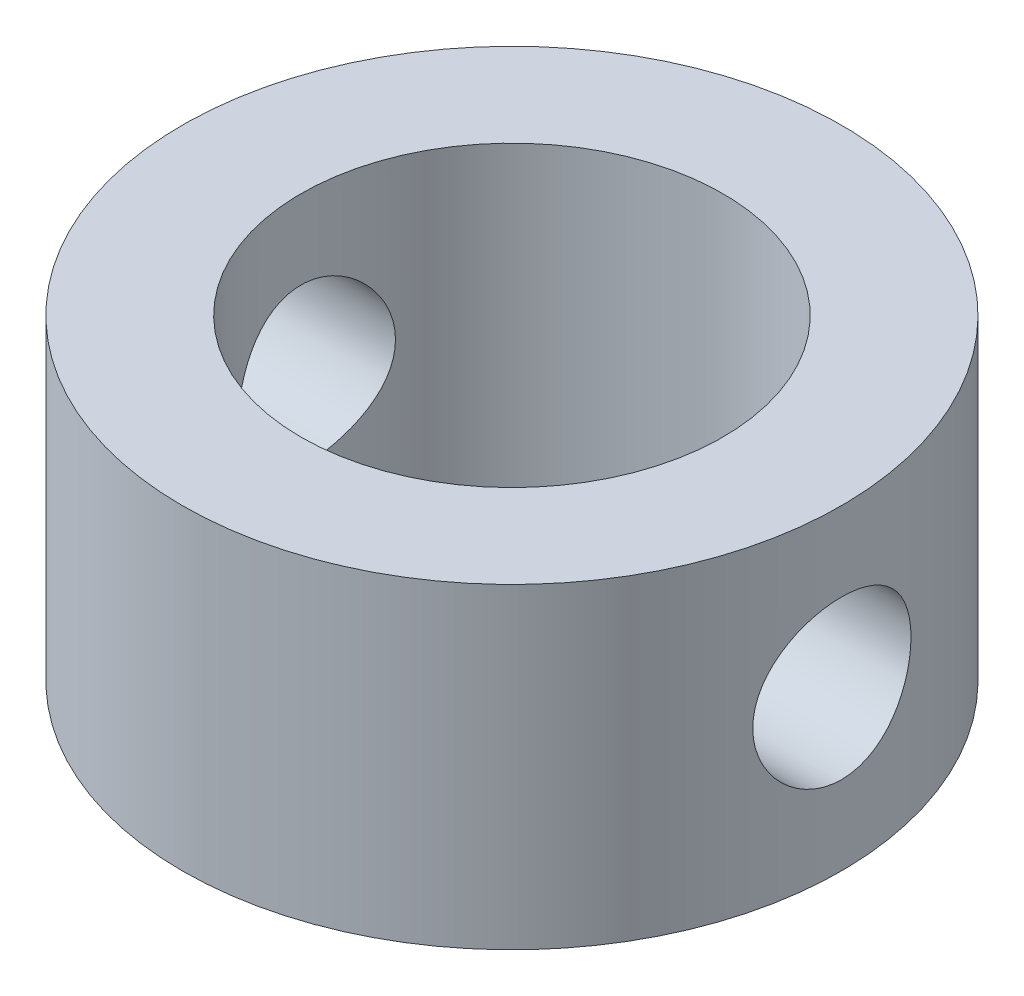
ISO-10303-21;
HEADER;
FILE_DESCRIPTION(('STEP AP214'),'2;1');
FILE_NAME('part.step','',(''),(''),'','','');
FILE_SCHEMA(('AUTOMOTIVE_DESIGN { 1 0 10303 214 1 1 1 1 }'));
ENDSEC;
DATA;
#1=APPLICATION_CONTEXT('core data for automotive mechanical design processes');
#2=APPLICATION_PROTOCOL_DEFINITION('international standard','automotive_design',2000,#1);
#3=PRODUCT_CONTEXT('',#1,'mechanical');
#4=PRODUCT('Part','Part','',(#3));
#5=PRODUCT_RELATED_PRODUCT_CATEGORY('part','',(#4));
#6=PRODUCT_DEFINITION_FORMATION('','',#4);
#7=PRODUCT_DEFINITION_CONTEXT('part definition',#1,'design');
#8=PRODUCT_DEFINITION('design','',#6,#7);
#9=PRODUCT_DEFINITION_SHAPE('','',#8);
#10=(LENGTH_UNIT() NAMED_UNIT(*) SI_UNIT(.MILLI.,.METRE.));
#11=(NAMED_UNIT(*) PLANE_ANGLE_UNIT() SI_UNIT($,.RADIAN.));
#12=(NAMED_UNIT(*) SI_UNIT($,.STERADIAN.) SOLID_ANGLE_UNIT());
#13=UNCERTAINTY_MEASURE_WITH_UNIT(LENGTH_MEASURE(1.E-05),#10,'distance_accuracy_value','');
#14=(GEOMETRIC_REPRESENTATION_CONTEXT(3) GLOBAL_UNCERTAINTY_ASSIGNED_CONTEXT((#13)) GLOBAL_UNIT_ASSIGNED_CONTEXT((#10,
#11,#12)) REPRESENTATION_CONTEXT('',''));
#15=CARTESIAN_POINT('',(0.,0.,0.));
#16=DIRECTION('',(0.,0.,1.));
#17=DIRECTION('',(1.,0.,0.));
#18=AXIS2_PLACEMENT_3D('',#15,#16,#17);
#19=CARTESIAN_POINT('',(0.,12.,0.));
#20=DIRECTION('',(0.,1.,0.));
#21=DIRECTION('',(0.,0.,1.));
#22=AXIS2_PLACEMENT_3D('',#19,#20,#21);
#23=PLANE('',#22);
#24=CARTESIAN_POINT('',(0.,12.,0.));
#25=DIRECTION('',(0.,1.,0.));
#26=DIRECTION('',(0.,0.,1.));
#27=AXIS2_PLACEMENT_3D('',#24,#25,#26);
#28=CIRCLE('',#27,12.5);
#29=CARTESIAN_POINT('',(0.,12.,12.5));
#30=VERTEX_POINT('',#29);
#31=EDGE_CURVE('E10',#30,#30,#28,.T.);
#32=ORIENTED_EDGE('',*,*,#31,.T.);
#33=EDGE_LOOP('',(#32));
#34=FACE_BOUND('',#33,.T.);
#35=CARTESIAN_POINT('',(0.,12.,0.));
#36=DIRECTION('',(0.,1.,0.));
#37=DIRECTION('',(0.,0.,1.));
#38=AXIS2_PLACEMENT_3D('',#35,#36,#37);
#39=CIRCLE('',#38,8.);
#40=CARTESIAN_POINT('',(0.,12.,8.));
#41=VERTEX_POINT('',#40);
#42=EDGE_CURVE('E49',#41,#41,#39,.T.);
#43=ORIENTED_EDGE('',*,*,#42,.F.);
#44=EDGE_LOOP('',(#43));
#45=FACE_BOUND('',#44,.T.);
#46=ADVANCED_FACE('F31',(#34,#45),#23,.T.);
#47=CARTESIAN_POINT('',(0.,0.,0.));
#48=DIRECTION('',(0.,1.,0.));
#49=DIRECTION('',(0.,0.,1.));
#50=AXIS2_PLACEMENT_3D('',#47,#48,#49);
#51=PLANE('',#50);
#52=CARTESIAN_POINT('',(0.,0.,0.));
#53=DIRECTION('',(0.,1.,0.));
#54=DIRECTION('',(0.,0.,1.));
#55=AXIS2_PLACEMENT_3D('',#52,#53,#54);
#56=CIRCLE('',#55,12.5);
#57=CARTESIAN_POINT('',(0.,0.,12.5));
#58=VERTEX_POINT('',#57);
#59=EDGE_CURVE('E44',#58,#58,#56,.T.);
#60=ORIENTED_EDGE('',*,*,#59,.F.);
#61=EDGE_LOOP('',(#60));
#62=FACE_BOUND('',#61,.T.);
#63=CARTESIAN_POINT('',(0.,0.,0.));
#64=DIRECTION('',(0.,1.,0.));
#65=DIRECTION('',(0.,0.,1.));
#66=AXIS2_PLACEMENT_3D('',#63,#64,#65);
#67=CIRCLE('',#66,8.);
#68=CARTESIAN_POINT('',(0.,0.,8.));
#69=VERTEX_POINT('',#68);
#70=EDGE_CURVE('E52',#69,#69,#67,.T.);
#71=ORIENTED_EDGE('',*,*,#70,.T.);
#72=EDGE_LOOP('',(#71));
#73=FACE_BOUND('',#72,.T.);
#74=ADVANCED_FACE('F85',(#62,#73),#51,.F.);
#75=CARTESIAN_POINT('',(0.,12.,0.));
#76=DIRECTION('',(0.,-1.,0.));
#77=DIRECTION('',(0.,0.,-1.));
#78=AXIS2_PLACEMENT_3D('',#75,#76,#77);
#79=CYLINDRICAL_SURFACE('',#78,12.5);
#80=CARTESIAN_POINT('',(-12.1346610995116,6.,-3.));
#81=CARTESIAN_POINT('',(-12.1346643709057,6.16588631394364,-2.99999492639599));
#82=CARTESIAN_POINT('',(-12.1380998279897,6.33183030182243,-2.98619401575549));
#83=CARTESIAN_POINT('',(-12.1514386999622,6.65896835271962,-2.93143372377318));
#84=CARTESIAN_POINT('',(-12.1613461803941,6.82015936348798,-2.89045727127241));
#85=CARTESIAN_POINT('',(-12.1864438536979,7.13301229540291,-2.78273587845348));
#86=CARTESIAN_POINT('',(-12.2016275682829,7.28468563419401,-2.71602252749926));
#87=CARTESIAN_POINT('',(-12.2355589227548,7.57469954365719,-2.55881551789466));
#88=CARTESIAN_POINT('',(-12.2543066403104,7.71303982366955,-2.46832134098417));
#89=CARTESIAN_POINT('',(-12.2936793084446,7.97526881494018,-2.26416092165145));
#90=CARTESIAN_POINT('',(-12.3143323081787,8.09884715598952,-2.15010136587795));
#91=CARTESIAN_POINT('',(-12.3549444196641,8.32531539443417,-1.90289576315871));
#92=CARTESIAN_POINT('',(-12.3749034702238,8.42820347119262,-1.7697480383165));
#93=CARTESIAN_POINT('',(-12.4121875957975,8.61162643270601,-1.48603435008244));
#94=CARTESIAN_POINT('',(-12.429475709008,8.69185852354929,-1.33526735140698));
#95=CARTESIAN_POINT('',(-12.4591511096292,8.82572653731784,-1.0219036434405));
#96=CARTESIAN_POINT('',(-12.471539061815,8.87936606814532,-0.859308542342423));
#97=CARTESIAN_POINT('',(-12.4898200905274,8.95753815438648,-0.530137152798909));
#98=CARTESIAN_POINT('',(-12.4958305032045,8.98259721420822,-0.363692527540998));
#99=CARTESIAN_POINT('',(-12.5010873481438,9.00454751969164,-0.028860573975858));
#100=CARTESIAN_POINT('',(-12.5003347050497,9.00144261592415,0.139526485618309));
#101=CARTESIAN_POINT('',(-12.4922383642801,8.96753629921501,0.469819197188796));
#102=CARTESIAN_POINT('',(-12.4850298487431,8.93730291583144,0.631786969117105));
#103=CARTESIAN_POINT('',(-12.4649879597451,8.85090826203714,0.948279915829272));
#104=CARTESIAN_POINT('',(-12.4521543006312,8.79474567489715,1.10280471220598));
#105=CARTESIAN_POINT('',(-12.4220937673228,8.65761316725222,1.40154850796015));
#106=CARTESIAN_POINT('',(-12.4048305309055,8.57643674423159,1.54566890739797));
#107=CARTESIAN_POINT('',(-12.3677903650575,8.39173656633371,1.8184437481507));
#108=CARTESIAN_POINT('',(-12.3480130295253,8.28820919922672,1.94709568430374));
#109=CARTESIAN_POINT('',(-12.307523454591,8.0586845989154,2.18866676072892));
#110=CARTESIAN_POINT('',(-12.2868002024656,7.93219063383104,2.30111257110784));
#111=CARTESIAN_POINT('',(-12.247210122564,7.66192436384159,2.50329554889259));
#112=CARTESIAN_POINT('',(-12.2283433682075,7.51815137609684,2.59303181841776));
#113=CARTESIAN_POINT('',(-12.1945661246798,7.21653474373689,2.74751986313759));
#114=CARTESIAN_POINT('',(-12.1796724534131,7.05863494892363,2.81216594132899));
#115=CARTESIAN_POINT('',(-12.155748323081,6.73376687652317,2.91385324316721));
#116=CARTESIAN_POINT('',(-12.1467167199581,6.56680037531667,2.95089985341171));
#117=CARTESIAN_POINT('',(-12.1357772660229,6.23290661993213,2.99556850234642));
#118=CARTESIAN_POINT('',(-12.1337008786289,6.06607792748918,3.0038868332891));
#119=CARTESIAN_POINT('',(-12.1364495609797,5.7334168059252,2.99276203410493));
#120=CARTESIAN_POINT('',(-12.1412740503119,5.56758429419628,2.97332123871795));
#121=CARTESIAN_POINT('',(-12.1571201522343,5.24415408273907,2.90783852027801));
#122=CARTESIAN_POINT('',(-12.1680489760353,5.08647082408308,2.86219461484814));
#123=CARTESIAN_POINT('',(-12.1947857126682,4.78099217933293,2.74603914988784));
#124=CARTESIAN_POINT('',(-12.2105941678427,4.6331978945637,2.6755248260303));
#125=CARTESIAN_POINT('',(-12.2456689266469,4.34872124779604,2.51014743676234));
#126=CARTESIAN_POINT('',(-12.2649930224287,4.21229062599396,2.41486385815303));
#127=CARTESIAN_POINT('',(-12.3047764880024,3.95709926610609,2.2031905161038));
#128=CARTESIAN_POINT('',(-12.3252360287629,3.83834119901455,2.08679756812263));
#129=CARTESIAN_POINT('',(-12.3655511140332,3.61908499039076,1.8330286051264));
#130=CARTESIAN_POINT('',(-12.3853821651221,3.51906624401033,1.69523379949056));
#131=CARTESIAN_POINT('',(-12.4217193399952,3.34359153691497,1.40439761806721));
#132=CARTESIAN_POINT('',(-12.438225632785,3.26813432755534,1.25135701785302));
#133=CARTESIAN_POINT('',(-12.4659520953338,3.14455252272497,0.935406182533393));
#134=CARTESIAN_POINT('',(-12.4772089625634,3.09623767947837,0.772573732033521));
#135=CARTESIAN_POINT('',(-12.4933282808784,3.02773217960314,0.440797516621208));
#136=CARTESIAN_POINT('',(-12.4981918632553,3.00753654724451,0.271854838350956));
#137=CARTESIAN_POINT('',(-12.5009346170348,2.99610413221297,-0.0628273325379076));
#138=CARTESIAN_POINT('',(-12.4989850590467,3.0041572440584,-0.22854154859205));
#139=CARTESIAN_POINT('',(-12.4886960978661,3.04737996301755,-0.556181588106272));
#140=CARTESIAN_POINT('',(-12.4803568581455,3.08254887640871,-0.718107508375785));
#141=CARTESIAN_POINT('',(-12.4582475403262,3.17863682511571,-1.03289533638029));
#142=CARTESIAN_POINT('',(-12.4445026408745,3.23943656944082,-1.18579554017999));
#143=CARTESIAN_POINT('',(-12.4130357959962,3.3849502441486,-1.47930912419136));
#144=CARTESIAN_POINT('',(-12.3953133850962,3.46966697374628,-1.61992106367531));
#145=CARTESIAN_POINT('',(-12.3573152907204,3.66282547427691,-1.88826701153781));
#146=CARTESIAN_POINT('',(-12.3369914041701,3.77175507074358,-2.01564306622629));
#147=CARTESIAN_POINT('',(-12.2963112747441,4.00928761058973,-2.25054951565269));
#148=CARTESIAN_POINT('',(-12.2759550250775,4.13789544073631,-2.35807496614236));
#149=CARTESIAN_POINT('',(-12.2371275634283,4.41373939416014,-2.5519948518568));
#150=CARTESIAN_POINT('',(-12.2186938455572,4.561252620507,-2.63800316633773));
#151=CARTESIAN_POINT('',(-12.1862909651906,4.86906184650554,-2.78387070894251));
#152=CARTESIAN_POINT('',(-12.1723183758181,5.02934791567107,-2.84375002144868));
#153=CARTESIAN_POINT('',(-12.1527391085338,5.32459285351408,-2.92614436386637));
#154=CARTESIAN_POINT('',(-12.1460087939348,5.4580708282112,-2.95378236710749));
#155=CARTESIAN_POINT('',(-12.1369686046644,5.7276863740708,-2.99071161192546));
#156=CARTESIAN_POINT('',(-12.1346584140208,5.86382375442303,-3.00000416492674));
#157=CARTESIAN_POINT('',(-12.1346610995116,6.,-3.));
#158=B_SPLINE_CURVE_WITH_KNOTS('',3,(#80,#81,#82,#83,#84,#85,#86,#87,#88,#89,#90,#91,#92,#93,
#94,#95,#96,#97,#98,#99,#100,#101,#102,#103,#104,#105,#106,#107,#108,#109,#110,#111,#112,#113,
#114,#115,#116,#117,#118,#119,#120,#121,#122,#123,#124,#125,#126,#127,#128,#129,#130,#131,#132,
#133,#134,#135,#136,#137,#138,#139,#140,#141,#142,#143,#144,#145,#146,#147,#148,#149,#150,#151,
#152,#153,#154,#155,#156,#157),.UNSPECIFIED.,.T.,.F.,(4,2,2,2,2,2,2,2,2,2,2,2,2,2,2,2,2,2,2,2,2,
2,2,2,2,2,2,2,2,2,2,2,2,2,2,2,2,2,4),(0.,0.497159212189432,0.9946310265389,1.49149417875255,
1.98836816009861,2.49432418194046,3.00032470584734,3.51279830766303,4.02520236141813,
4.52800628486068,5.03074146609936,5.52318961529222,6.01566277459448,6.51231571921414,
7.00904899016388,7.51819168467208,8.02735450631452,8.5386395722652,9.04982482437227,
9.54852995993759,10.047193153326,10.5384749824062,11.0298114342859,11.5301065260644,
12.0304771548043,12.5422844123508,13.0540656468818,13.5622134292334,14.0702712827588,
14.5656502933719,15.0610166307768,15.5541024543049,16.047246011943,16.5514085771014,
17.0556965465884,17.56847227941,18.0808531634825,18.4890008491296,18.8971193572843),.UNSPECIFIED.);
#159=CARTESIAN_POINT('',(-12.1346610995116,6.,-3.));
#160=VERTEX_POINT('',#159);
#161=EDGE_CURVE('E75',#160,#160,#158,.T.);
#162=ORIENTED_EDGE('',*,*,#161,.T.);
#163=EDGE_LOOP('',(#162));
#164=FACE_BOUND('',#163,.T.);
#165=CARTESIAN_POINT('',(12.1346610995116,6.,-3.));
#166=CARTESIAN_POINT('',(12.1346643709057,5.83411368605636,-2.99999492639599));
#167=CARTESIAN_POINT('',(12.1380998279897,5.66816969817757,-2.98619401575549));
#168=CARTESIAN_POINT('',(12.1514386999622,5.34103164728038,-2.93143372377318));
#169=CARTESIAN_POINT('',(12.1613461803941,5.17984063651202,-2.89045727127241));
#170=CARTESIAN_POINT('',(12.1864438536979,4.86698770459709,-2.78273587845348));
#171=CARTESIAN_POINT('',(12.2016275682829,4.71531436580599,-2.71602252749926));
#172=CARTESIAN_POINT('',(12.2355589227548,4.42530045634281,-2.55881551789466));
#173=CARTESIAN_POINT('',(12.2543066403104,4.28696017633045,-2.46832134098417));
#174=CARTESIAN_POINT('',(12.2936793084446,4.02473118505982,-2.26416092165145));
#175=CARTESIAN_POINT('',(12.3143323081787,3.90115284401048,-2.15010136587795));
#176=CARTESIAN_POINT('',(12.3549444196641,3.67468460556583,-1.90289576315871));
#177=CARTESIAN_POINT('',(12.3749034702238,3.57179652880738,-1.7697480383165));
#178=CARTESIAN_POINT('',(12.4121875957975,3.38837356729399,-1.48603435008244));
#179=CARTESIAN_POINT('',(12.429475709008,3.30814147645071,-1.33526735140698));
#180=CARTESIAN_POINT('',(12.4591511096292,3.17427346268216,-1.0219036434405));
#181=CARTESIAN_POINT('',(12.471539061815,3.12063393185467,-0.859308542342424));
#182=CARTESIAN_POINT('',(12.4898200905274,3.04246184561352,-0.530137152798909));
#183=CARTESIAN_POINT('',(12.4958305032045,3.01740278579179,-0.363692527540998));
#184=CARTESIAN_POINT('',(12.5010873481438,2.99545248030836,-0.0288605739758578));
#185=CARTESIAN_POINT('',(12.5003347050497,2.99855738407585,0.13952648561831));
#186=CARTESIAN_POINT('',(12.4922383642801,3.03246370078499,0.469819197188797));
#187=CARTESIAN_POINT('',(12.4850298487431,3.06269708416856,0.631786969117106));
#188=CARTESIAN_POINT('',(12.4649879597451,3.14909173796286,0.948279915829272));
#189=CARTESIAN_POINT('',(12.4521543006312,3.20525432510285,1.10280471220598));
#190=CARTESIAN_POINT('',(12.4220937673228,3.34238683274778,1.40154850796015));
#191=CARTESIAN_POINT('',(12.4048305309055,3.42356325576841,1.54566890739797));
#192=CARTESIAN_POINT('',(12.3677903650575,3.60826343366629,1.8184437481507));
#193=CARTESIAN_POINT('',(12.3480130295253,3.71179080077329,1.94709568430374));
#194=CARTESIAN_POINT('',(12.307523454591,3.9413154010846,2.18866676072893));
#195=CARTESIAN_POINT('',(12.2868002024656,4.06780936616896,2.30111257110784));
#196=CARTESIAN_POINT('',(12.247210122564,4.33807563615842,2.50329554889259));
#197=CARTESIAN_POINT('',(12.2283433682075,4.48184862390316,2.59303181841776));
#198=CARTESIAN_POINT('',(12.1945661246798,4.78346525626311,2.74751986313759));
#199=CARTESIAN_POINT('',(12.1796724534131,4.94136505107637,2.81216594132899));
#200=CARTESIAN_POINT('',(12.155748323081,5.26623312347683,2.91385324316721));
#201=CARTESIAN_POINT('',(12.1467167199581,5.43319962468333,2.95089985341171));
#202=CARTESIAN_POINT('',(12.1357772660229,5.76709338006787,2.99556850234642));
#203=CARTESIAN_POINT('',(12.1337008786289,5.93392207251082,3.0038868332891));
#204=CARTESIAN_POINT('',(12.1364495609797,6.2665831940748,2.99276203410493));
#205=CARTESIAN_POINT('',(12.1412740503119,6.43241570580372,2.97332123871795));
#206=CARTESIAN_POINT('',(12.1571201522343,6.75584591726093,2.90783852027801));
#207=CARTESIAN_POINT('',(12.1680489760353,6.91352917591692,2.86219461484814));
#208=CARTESIAN_POINT('',(12.1947857126682,7.21900782066707,2.74603914988784));
#209=CARTESIAN_POINT('',(12.2105941678427,7.3668021054363,2.6755248260303));
#210=CARTESIAN_POINT('',(12.2456689266469,7.65127875220396,2.51014743676234));
#211=CARTESIAN_POINT('',(12.2649930224287,7.78770937400604,2.41486385815303));
#212=CARTESIAN_POINT('',(12.3047764880024,8.04290073389391,2.2031905161038));
#213=CARTESIAN_POINT('',(12.3252360287629,8.16165880098545,2.08679756812263));
#214=CARTESIAN_POINT('',(12.3655511140332,8.38091500960924,1.8330286051264));
#215=CARTESIAN_POINT('',(12.3853821651221,8.48093375598967,1.69523379949056));
#216=CARTESIAN_POINT('',(12.4217193399952,8.65640846308503,1.40439761806721));
#217=CARTESIAN_POINT('',(12.438225632785,8.73186567244466,1.25135701785302));
#218=CARTESIAN_POINT('',(12.4659520953338,8.85544747727503,0.935406182533392));
#219=CARTESIAN_POINT('',(12.4772089625634,8.90376232052163,0.772573732033521));
#220=CARTESIAN_POINT('',(12.4933282808784,8.97226782039686,0.440797516621209));
#221=CARTESIAN_POINT('',(12.4981918632553,8.99246345275549,0.271854838350956));
#222=CARTESIAN_POINT('',(12.5009346170348,9.00389586778703,-0.0628273325379081));
#223=CARTESIAN_POINT('',(12.4989850590467,8.9958427559416,-0.22854154859205));
#224=CARTESIAN_POINT('',(12.4886960978661,8.95262003698245,-0.556181588106273));
#225=CARTESIAN_POINT('',(12.4803568581455,8.91745112359129,-0.718107508375786));
#226=CARTESIAN_POINT('',(12.4582475403262,8.8213631748843,-1.03289533638029));
#227=CARTESIAN_POINT('',(12.4445026408745,8.76056343055918,-1.18579554017999));
#228=CARTESIAN_POINT('',(12.4130357959962,8.6150497558514,-1.47930912419136));
#229=CARTESIAN_POINT('',(12.3953133850962,8.53033302625372,-1.61992106367531));
#230=CARTESIAN_POINT('',(12.3573152907204,8.33717452572309,-1.88826701153781));
#231=CARTESIAN_POINT('',(12.3369914041701,8.22824492925642,-2.01564306622629));
#232=CARTESIAN_POINT('',(12.2963112747441,7.99071238941027,-2.25054951565269));
#233=CARTESIAN_POINT('',(12.2759550250775,7.86210455926369,-2.35807496614236));
#234=CARTESIAN_POINT('',(12.2371275634283,7.58626060583986,-2.55199485185679));
#235=CARTESIAN_POINT('',(12.2186938455572,7.438747379493,-2.63800316633773));
#236=CARTESIAN_POINT('',(12.1862909651906,7.13093815349446,-2.78387070894251));
#237=CARTESIAN_POINT('',(12.1723183758181,6.97065208432893,-2.84375002144868));
#238=CARTESIAN_POINT('',(12.1527391085338,6.67540714648592,-2.92614436386637));
#239=CARTESIAN_POINT('',(12.1460087939348,6.5419291717888,-2.95378236710749));
#240=CARTESIAN_POINT('',(12.1369686046644,6.2723136259292,-2.99071161192546));
#241=CARTESIAN_POINT('',(12.1346584140208,6.13617624557697,-3.00000416492674));
#242=CARTESIAN_POINT('',(12.1346610995116,6.,-3.));
#243=B_SPLINE_CURVE_WITH_KNOTS('',3,(#165,#166,#167,#168,#169,#170,#171,#172,#173,#174,#175,
#176,#177,#178,#179,#180,#181,#182,#183,#184,#185,#186,#187,#188,#189,#190,#191,#192,#193,#194,
#195,#196,#197,#198,#199,#200,#201,#202,#203,#204,#205,#206,#207,#208,#209,#210,#211,#212,#213,
#214,#215,#216,#217,#218,#219,#220,#221,#222,#223,#224,#225,#226,#227,#228,#229,#230,#231,#232,
#233,#234,#235,#236,#237,#238,#239,#240,#241,#242),.UNSPECIFIED.,.T.,.F.,(4,2,2,2,2,2,2,2,2,2,2,
2,2,2,2,2,2,2,2,2,2,2,2,2,2,2,2,2,2,2,2,2,2,2,2,2,2,2,4),(0.,0.497159212189432,0.9946310265389,
1.49149417875255,1.98836816009861,2.49432418194046,3.00032470584734,3.51279830766303,
4.02520236141813,4.52800628486068,5.03074146609936,5.52318961529222,6.01566277459448,
6.51231571921414,7.00904899016388,7.51819168467208,8.02735450631452,8.5386395722652,
9.04982482437227,9.54852995993759,10.047193153326,10.5384749824062,11.0298114342859,
11.5301065260644,12.0304771548043,12.5422844123508,13.0540656468818,13.5622134292334,
14.0702712827588,14.5656502933719,15.0610166307768,15.5541024543049,16.047246011943,
16.5514085771014,17.0556965465884,17.56847227941,18.0808531634825,18.4890008491296,
18.8971193572843),.UNSPECIFIED.);
#244=CARTESIAN_POINT('',(12.1346610995116,6.,-3.));
#245=VERTEX_POINT('',#244);
#246=EDGE_CURVE('E71',#245,#245,#243,.T.);
#247=ORIENTED_EDGE('',*,*,#246,.T.);
#248=EDGE_LOOP('',(#247));
#249=FACE_BOUND('',#248,.T.);
#250=ORIENTED_EDGE('',*,*,#31,.F.);
#251=EDGE_LOOP('',(#250));
#252=FACE_BOUND('',#251,.T.);
#253=ORIENTED_EDGE('',*,*,#59,.T.);
#254=EDGE_LOOP('',(#253));
#255=FACE_BOUND('',#254,.T.);
#256=ADVANCED_FACE('F33',(#164,#249,#252,#255),#79,.T.);
#257=CARTESIAN_POINT('',(0.,12.,0.));
#258=DIRECTION('',(0.,-1.,0.));
#259=DIRECTION('',(0.,0.,-1.));
#260=AXIS2_PLACEMENT_3D('',#257,#258,#259);
#261=CYLINDRICAL_SURFACE('',#260,8.);
#262=CARTESIAN_POINT('',(-7.41619848709566,6.,-3.));
#263=CARTESIAN_POINT('',(-7.41619281215226,6.1620149674834,-3.00000608211288));
#264=CARTESIAN_POINT('',(-7.42156520296313,6.32398984512619,-2.98683195095364));
#265=CARTESIAN_POINT('',(-7.44232318425766,6.64305616593522,-2.93472375787483));
#266=CARTESIAN_POINT('',(-7.45770847484803,6.80014775521168,-2.89579046745932));
#267=CARTESIAN_POINT('',(-7.49650960610891,7.10475074318883,-2.79379315222297));
#268=CARTESIAN_POINT('',(-7.51990619151695,7.25228411329191,-2.73078694533005));
#269=CARTESIAN_POINT('',(-7.57206268400017,7.53474379364794,-2.58263713485087));
#270=CARTESIAN_POINT('',(-7.60082420131042,7.66966630056785,-2.49748688189993));
#271=CARTESIAN_POINT('',(-7.66207149335192,7.9297806232427,-2.30293322748412));
#272=CARTESIAN_POINT('',(-7.69466683848217,8.054257059258,-2.19260762426636));
#273=CARTESIAN_POINT('',(-7.75899501256083,8.28344562934377,-1.95279167955761));
#274=CARTESIAN_POINT('',(-7.79072765629295,8.38815354748393,-1.82329726051329));
#275=CARTESIAN_POINT('',(-7.8510574787339,8.578279024591,-1.54338931035527));
#276=CARTESIAN_POINT('',(-7.87951122447087,8.66291894943166,-1.39241389507607));
#277=CARTESIAN_POINT('',(-7.92876015947619,8.80530234504988,-1.07711154393047));
#278=CARTESIAN_POINT('',(-7.94955800433994,8.86305514398396,-0.912789261867064));
#279=CARTESIAN_POINT('',(-7.98037394206897,8.94751579154922,-0.582978683353668));
#280=CARTESIAN_POINT('',(-7.99081830429549,8.97545525488091,-0.417846394563195));
#281=CARTESIAN_POINT('',(-8.0012802821588,9.00344240188998,-0.0849287275895659));
#282=CARTESIAN_POINT('',(-8.0013012882982,9.0034991552374,0.0828557701256808));
#283=CARTESIAN_POINT('',(-7.99118531807773,8.97643647706967,0.40748708612894));
#284=CARTESIAN_POINT('',(-7.98155083993306,8.95066140410244,0.564464356533755));
#285=CARTESIAN_POINT('',(-7.95386549864585,8.87492816954882,0.871678435968828));
#286=CARTESIAN_POINT('',(-7.93581403951378,8.82496829547565,1.02191476686077));
#287=CARTESIAN_POINT('',(-7.89275538334835,8.70165909664858,1.31397803460604));
#288=CARTESIAN_POINT('',(-7.86765078939303,8.62797998946421,1.45565078457398));
#289=CARTESIAN_POINT('',(-7.81302620451409,8.4596158061402,1.72497321591576));
#290=CARTESIAN_POINT('',(-7.78350479028858,8.36492395396097,1.85261835386705));
#291=CARTESIAN_POINT('',(-7.72105059308269,8.15074542743768,2.09818097359933));
#292=CARTESIAN_POINT('',(-7.68801927514871,8.03013216871469,2.2150922905172));
#293=CARTESIAN_POINT('',(-7.62364921304341,7.77081401334133,2.42740791139661));
#294=CARTESIAN_POINT('',(-7.59231089545926,7.63210458676857,2.52280681389449));
#295=CARTESIAN_POINT('',(-7.53425406951149,7.33656106512264,2.69131223613209));
#296=CARTESIAN_POINT('',(-7.50765354114236,7.17939301282854,2.76387695690677));
#297=CARTESIAN_POINT('',(-7.4634487707231,6.85380754987224,2.88112928869848));
#298=CARTESIAN_POINT('',(-7.44583952363152,6.68539645687429,2.925832412077));
#299=CARTESIAN_POINT('',(-7.42279194491541,6.35204807532452,2.98380383422378));
#300=CARTESIAN_POINT('',(-7.41673570495336,6.18743178891606,2.99867042318746));
#301=CARTESIAN_POINT('',(-7.41573079037772,5.85798128652817,3.00115771271731));
#302=CARTESIAN_POINT('',(-7.42077934004762,5.69314713529811,2.9887852218731));
#303=CARTESIAN_POINT('',(-7.44078763262529,5.37614015542173,2.93859467040517));
#304=CARTESIAN_POINT('',(-7.45526552433718,5.2237377284699,2.90201236668503));
#305=CARTESIAN_POINT('',(-7.49192974091902,4.92730411056039,2.8059954928122));
#306=CARTESIAN_POINT('',(-7.51411764500121,4.78327464166394,2.74655624069231));
#307=CARTESIAN_POINT('',(-7.56472486232391,4.50167112384737,2.60400584550571));
#308=CARTESIAN_POINT('',(-7.59334657784192,4.36454141572526,2.52009090354098));
#309=CARTESIAN_POINT('',(-7.6532562858852,4.10574203654798,2.33182635724954));
#310=CARTESIAN_POINT('',(-7.68454525188137,3.98407805075075,2.22746927392868));
#311=CARTESIAN_POINT('',(-7.74866093106386,3.75166325360979,1.99345468180189));
#312=CARTESIAN_POINT('',(-7.7814593871406,3.64209318246249,1.86261268298213));
#313=CARTESIAN_POINT('',(-7.84299749926599,3.44632326482113,1.5835949435063));
#314=CARTESIAN_POINT('',(-7.87173714215327,3.36012349410832,1.43541914664534));
#315=CARTESIAN_POINT('',(-7.92189971409105,3.21410788760077,1.12603265893695));
#316=CARTESIAN_POINT('',(-7.9433476267602,3.15420175241479,0.964868866129252));
#317=CARTESIAN_POINT('',(-7.97658873425142,3.06268717230016,0.633763775046508));
#318=CARTESIAN_POINT('',(-7.98838646598825,3.0310654291552,0.463826641447185));
#319=CARTESIAN_POINT('',(-8.00056814634147,2.99845119449035,0.130671170547631));
#320=CARTESIAN_POINT('',(-8.00157721907528,2.99578103388202,-0.0323615361216906));
#321=CARTESIAN_POINT('',(-7.99369779618447,3.01683031889079,-0.356453572824848));
#322=CARTESIAN_POINT('',(-7.98481049426262,3.04054658177171,-0.517513138490515));
#323=CARTESIAN_POINT('',(-7.95842179207541,3.11251770298724,-0.829096496754253));
#324=CARTESIAN_POINT('',(-7.9411358275603,3.16015981175672,-0.979781462137668));
#325=CARTESIAN_POINT('',(-7.89975567241984,3.27802002676872,-1.27103094601278));
#326=CARTESIAN_POINT('',(-7.87566019311345,3.3482424066095,-1.41159354255109));
#327=CARTESIAN_POINT('',(-7.8218123660013,3.51262788700963,-1.68508035398882));
#328=CARTESIAN_POINT('',(-7.79186480217587,3.60767328102833,-1.81743509769369));
#329=CARTESIAN_POINT('',(-7.72999015389759,3.81761566037518,-2.06483469504674));
#330=CARTESIAN_POINT('',(-7.69806236548317,3.93251973161564,-2.17987334251185));
#331=CARTESIAN_POINT('',(-7.63376259478074,4.18612826329024,-2.39562428472386));
#332=CARTESIAN_POINT('',(-7.60145610697262,4.32576880430908,-2.49525999632032));
#333=CARTESIAN_POINT('',(-7.54196650008334,4.62083173914619,-2.66969419113705));
#334=CARTESIAN_POINT('',(-7.51478391266386,4.77625576810524,-2.74449009756384));
#335=CARTESIAN_POINT('',(-7.46804539702406,5.10591136195261,-2.86931773948447));
#336=CARTESIAN_POINT('',(-7.44887606566003,5.28066873303041,-2.91812005798766));
#337=CARTESIAN_POINT('',(-7.42295988688337,5.63697054390473,-2.98344713444437));
#338=CARTESIAN_POINT('',(-7.41620484418155,5.81851042539443,-2.99999318680184));
#339=CARTESIAN_POINT('',(-7.41619848709566,6.,-3.));
#340=B_SPLINE_CURVE_WITH_KNOTS('',3,(#262,#263,#264,#265,#266,#267,#268,#269,#270,#271,#272,
#273,#274,#275,#276,#277,#278,#279,#280,#281,#282,#283,#284,#285,#286,#287,#288,#289,#290,#291,
#292,#293,#294,#295,#296,#297,#298,#299,#300,#301,#302,#303,#304,#305,#306,#307,#308,#309,#310,
#311,#312,#313,#314,#315,#316,#317,#318,#319,#320,#321,#322,#323,#324,#325,#326,#327,#328,#329,
#330,#331,#332,#333,#334,#335,#336,#337,#338,#339),.UNSPECIFIED.,.T.,.F.,(4,2,2,2,2,2,2,2,2,2,2,
2,2,2,2,2,2,2,2,2,2,2,2,2,2,2,2,2,2,2,2,2,2,2,2,2,2,2,4),(0.,0.485369082889299,0.97072362930767,
1.45491971362402,1.93926135947583,2.44549304813252,2.95183257656962,3.47540144283838,
3.99878852773656,4.49960036990354,5.0002493082071,5.47612945617385,5.95204330537667,
6.43488262432332,6.91787787268947,7.42913350142745,7.94051735665666,8.46325184520833,
8.98569503290589,9.47931315500611,9.97280790797409,10.4428769187604,10.9130422687869,
11.4008312203128,11.8887989695235,12.4077003400689,12.9266033932,13.4437101779998,
13.9605737113989,14.4473144111951,14.933996406586,15.4088054802742,15.883704470453,
16.3785664737361,16.8736054180957,17.394771991038,17.9159926110813,18.4600635776149,
19.0037752466575),.UNSPECIFIED.);
#341=CARTESIAN_POINT('',(-7.41619848709566,6.,-3.));
#342=VERTEX_POINT('',#341);
#343=EDGE_CURVE('E36',#342,#342,#340,.T.);
#344=ORIENTED_EDGE('',*,*,#343,.F.);
#345=EDGE_LOOP('',(#344));
#346=FACE_BOUND('',#345,.T.);
#347=CARTESIAN_POINT('',(7.41619848709566,6.,-3.));
#348=CARTESIAN_POINT('',(7.41619281215226,5.8379850325166,-3.00000608211288));
#349=CARTESIAN_POINT('',(7.42156520296313,5.67601015487381,-2.98683195095364));
#350=CARTESIAN_POINT('',(7.44232318425766,5.35694383406478,-2.93472375787483));
#351=CARTESIAN_POINT('',(7.45770847484803,5.19985224478832,-2.89579046745932));
#352=CARTESIAN_POINT('',(7.49650960610891,4.89524925681117,-2.79379315222297));
#353=CARTESIAN_POINT('',(7.51990619151696,4.74771588670809,-2.73078694533005));
#354=CARTESIAN_POINT('',(7.57206268400018,4.46525620635206,-2.58263713485087));
#355=CARTESIAN_POINT('',(7.60082420131042,4.33033369943215,-2.49748688189993));
#356=CARTESIAN_POINT('',(7.66207149335192,4.0702193767573,-2.30293322748412));
#357=CARTESIAN_POINT('',(7.69466683848217,3.945742940742,-2.19260762426636));
#358=CARTESIAN_POINT('',(7.75899501256083,3.71655437065623,-1.95279167955761));
#359=CARTESIAN_POINT('',(7.79072765629295,3.61184645251608,-1.82329726051329));
#360=CARTESIAN_POINT('',(7.8510574787339,3.421720975409,-1.54338931035527));
#361=CARTESIAN_POINT('',(7.87951122447087,3.33708105056834,-1.39241389507607));
#362=CARTESIAN_POINT('',(7.92876015947619,3.19469765495012,-1.07711154393047));
#363=CARTESIAN_POINT('',(7.94955800433994,3.13694485601604,-0.912789261867064));
#364=CARTESIAN_POINT('',(7.98037394206897,3.05248420845078,-0.582978683353668));
#365=CARTESIAN_POINT('',(7.99081830429549,3.02454474511909,-0.417846394563195));
#366=CARTESIAN_POINT('',(8.0012802821588,2.99655759811003,-0.0849287275895654));
#367=CARTESIAN_POINT('',(8.0013012882982,2.9965008447626,0.0828557701256812));
#368=CARTESIAN_POINT('',(7.99118531807773,3.02356352293033,0.407487086128941));
#369=CARTESIAN_POINT('',(7.98155083993306,3.04933859589756,0.564464356533756));
#370=CARTESIAN_POINT('',(7.95386549864585,3.12507183045118,0.871678435968829));
#371=CARTESIAN_POINT('',(7.93581403951378,3.17503170452435,1.02191476686077));
#372=CARTESIAN_POINT('',(7.89275538334835,3.29834090335142,1.31397803460604));
#373=CARTESIAN_POINT('',(7.86765078939303,3.37202001053579,1.45565078457398));
#374=CARTESIAN_POINT('',(7.81302620451409,3.5403841938598,1.72497321591576));
#375=CARTESIAN_POINT('',(7.78350479028858,3.63507604603904,1.85261835386705));
#376=CARTESIAN_POINT('',(7.72105059308269,3.84925457256232,2.09818097359933));
#377=CARTESIAN_POINT('',(7.68801927514871,3.96986783128531,2.21509229051721));
#378=CARTESIAN_POINT('',(7.62364921304342,4.22918598665867,2.42740791139661));
#379=CARTESIAN_POINT('',(7.59231089545926,4.36789541323143,2.52280681389449));
#380=CARTESIAN_POINT('',(7.53425406951149,4.66343893487737,2.69131223613209));
#381=CARTESIAN_POINT('',(7.50765354114235,4.82060698717146,2.76387695690677));
#382=CARTESIAN_POINT('',(7.4634487707231,5.14619245012777,2.88112928869848));
#383=CARTESIAN_POINT('',(7.44583952363152,5.31460354312571,2.925832412077));
#384=CARTESIAN_POINT('',(7.42279194491541,5.64795192467549,2.98380383422379));
#385=CARTESIAN_POINT('',(7.41673570495336,5.81256821108394,2.99867042318746));
#386=CARTESIAN_POINT('',(7.41573079037772,6.14201871347183,3.00115771271731));
#387=CARTESIAN_POINT('',(7.42077934004762,6.30685286470189,2.9887852218731));
#388=CARTESIAN_POINT('',(7.44078763262529,6.62385984457827,2.93859467040517));
#389=CARTESIAN_POINT('',(7.45526552433718,6.7762622715301,2.90201236668503));
#390=CARTESIAN_POINT('',(7.49192974091902,7.07269588943961,2.80599549281221));
#391=CARTESIAN_POINT('',(7.51411764500121,7.21672535833606,2.74655624069231));
#392=CARTESIAN_POINT('',(7.56472486232391,7.49832887615263,2.60400584550571));
#393=CARTESIAN_POINT('',(7.59334657784192,7.63545858427474,2.52009090354098));
#394=CARTESIAN_POINT('',(7.6532562858852,7.89425796345202,2.33182635724954));
#395=CARTESIAN_POINT('',(7.68454525188137,8.01592194924925,2.22746927392868));
#396=CARTESIAN_POINT('',(7.74866093106387,8.24833674639021,1.99345468180189));
#397=CARTESIAN_POINT('',(7.7814593871406,8.35790681753751,1.86261268298212));
#398=CARTESIAN_POINT('',(7.84299749926599,8.55367673517887,1.5835949435063));
#399=CARTESIAN_POINT('',(7.87173714215327,8.63987650589168,1.43541914664534));
#400=CARTESIAN_POINT('',(7.92189971409105,8.78589211239922,1.12603265893695));
#401=CARTESIAN_POINT('',(7.9433476267602,8.84579824758521,0.964868866129252));
#402=CARTESIAN_POINT('',(7.97658873425142,8.93731282769984,0.633763775046507));
#403=CARTESIAN_POINT('',(7.98838646598825,8.9689345708448,0.463826641447183));
#404=CARTESIAN_POINT('',(8.00056814634147,9.00154880550965,0.130671170547629));
#405=CARTESIAN_POINT('',(8.00157721907528,9.00421896611798,-0.0323615361216928));
#406=CARTESIAN_POINT('',(7.99369779618447,8.98316968110921,-0.35645357282485));
#407=CARTESIAN_POINT('',(7.98481049426262,8.95945341822829,-0.517513138490516));
#408=CARTESIAN_POINT('',(7.95842179207541,8.88748229701276,-0.829096496754254));
#409=CARTESIAN_POINT('',(7.9411358275603,8.83984018824328,-0.97978146213767));
#410=CARTESIAN_POINT('',(7.89975567241984,8.72197997323128,-1.27103094601278));
#411=CARTESIAN_POINT('',(7.87566019311345,8.6517575933905,-1.41159354255109));
#412=CARTESIAN_POINT('',(7.8218123660013,8.48737211299037,-1.68508035398882));
#413=CARTESIAN_POINT('',(7.79186480217587,8.39232671897167,-1.81743509769369));
#414=CARTESIAN_POINT('',(7.72999015389759,8.18238433962482,-2.06483469504674));
#415=CARTESIAN_POINT('',(7.69806236548317,8.06748026838436,-2.17987334251185));
#416=CARTESIAN_POINT('',(7.63376259478074,7.81387173670976,-2.39562428472386));
#417=CARTESIAN_POINT('',(7.60145610697262,7.67423119569092,-2.49525999632032));
#418=CARTESIAN_POINT('',(7.54196650008334,7.37916826085381,-2.66969419113705));
#419=CARTESIAN_POINT('',(7.51478391266386,7.22374423189476,-2.74449009756384));
#420=CARTESIAN_POINT('',(7.46804539702406,6.89408863804739,-2.86931773948447));
#421=CARTESIAN_POINT('',(7.44887606566003,6.71933126696959,-2.91812005798766));
#422=CARTESIAN_POINT('',(7.42295988688337,6.36302945609527,-2.98344713444437));
#423=CARTESIAN_POINT('',(7.41620484418155,6.18148957460557,-2.99999318680184));
#424=CARTESIAN_POINT('',(7.41619848709566,6.,-3.));
#425=B_SPLINE_CURVE_WITH_KNOTS('',3,(#347,#348,#349,#350,#351,#352,#353,#354,#355,#356,#357,
#358,#359,#360,#361,#362,#363,#364,#365,#366,#367,#368,#369,#370,#371,#372,#373,#374,#375,#376,
#377,#378,#379,#380,#381,#382,#383,#384,#385,#386,#387,#388,#389,#390,#391,#392,#393,#394,#395,
#396,#397,#398,#399,#400,#401,#402,#403,#404,#405,#406,#407,#408,#409,#410,#411,#412,#413,#414,
#415,#416,#417,#418,#419,#420,#421,#422,#423,#424),.UNSPECIFIED.,.T.,.F.,(4,2,2,2,2,2,2,2,2,2,2,
2,2,2,2,2,2,2,2,2,2,2,2,2,2,2,2,2,2,2,2,2,2,2,2,2,2,2,4),(0.,0.485369082889299,0.97072362930767,
1.45491971362402,1.93926135947583,2.44549304813252,2.95183257656962,3.47540144283838,
3.99878852773656,4.49960036990354,5.00024930820711,5.47612945617385,5.95204330537667,
6.43488262432332,6.91787787268948,7.42913350142745,7.94051735665666,8.46325184520833,
8.98569503290589,9.47931315500611,9.97280790797409,10.4428769187604,10.9130422687869,
11.4008312203128,11.8887989695235,12.4077003400689,12.9266033932,13.4437101779998,
13.9605737113989,14.4473144111951,14.933996406586,15.4088054802742,15.883704470453,
16.3785664737361,16.8736054180957,17.394771991038,17.9159926110813,18.4600635776149,
19.0037752466575),.UNSPECIFIED.);
#426=CARTESIAN_POINT('',(7.41619848709566,6.,-3.));
#427=VERTEX_POINT('',#426);
#428=EDGE_CURVE('E54',#427,#427,#425,.T.);
#429=ORIENTED_EDGE('',*,*,#428,.F.);
#430=EDGE_LOOP('',(#429));
#431=FACE_BOUND('',#430,.T.);
#432=ORIENTED_EDGE('',*,*,#42,.T.);
#433=EDGE_LOOP('',(#432));
#434=FACE_BOUND('',#433,.T.);
#435=ORIENTED_EDGE('',*,*,#70,.F.);
#436=EDGE_LOOP('',(#435));
#437=FACE_BOUND('',#436,.T.);
#438=ADVANCED_FACE('F58',(#346,#431,#434,#437),#261,.F.);
#439=CARTESIAN_POINT('',(-24.,6.,0.));
#440=DIRECTION('',(1.,0.,0.));
#441=DIRECTION('',(0.,0.,-1.));
#442=AXIS2_PLACEMENT_3D('',#439,#440,#441);
#443=CYLINDRICAL_SURFACE('',#442,3.);
#444=ORIENTED_EDGE('',*,*,#428,.T.);
#445=EDGE_LOOP('',(#444));
#446=FACE_BOUND('',#445,.T.);
#447=ORIENTED_EDGE('',*,*,#246,.F.);
#448=EDGE_LOOP('',(#447));
#449=FACE_BOUND('',#448,.T.);
#450=ADVANCED_FACE('F64',(#446,#449),#443,.F.);
#451=ORIENTED_EDGE('',*,*,#343,.T.);
#452=EDGE_LOOP('',(#451));
#453=FACE_BOUND('',#452,.T.);
#454=ORIENTED_EDGE('',*,*,#161,.F.);
#455=EDGE_LOOP('',(#454));
#456=FACE_BOUND('',#455,.T.);
#457=ADVANCED_FACE('F61',(#453,#456),#443,.F.);
#458=CLOSED_SHELL('',(#46,#74,#256,#438,#450,#457));
#459=MANIFOLD_SOLID_BREP('B2',#458);
#460=ADVANCED_BREP_SHAPE_REPRESENTATION('',(#18,#459),#14);
#461=SHAPE_DEFINITION_REPRESENTATION(#9,#460);
ENDSEC;
END-ISO-10303-21;
